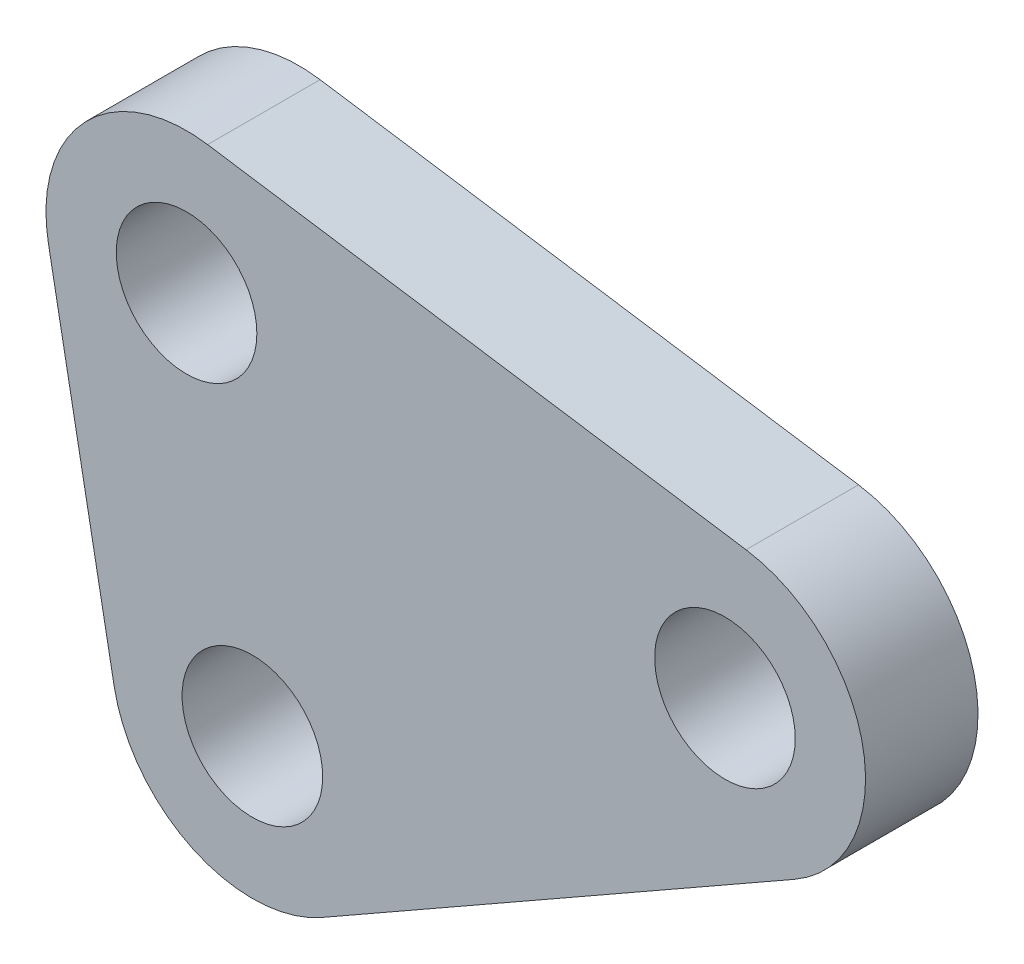
ISO-10303-21;
HEADER;
FILE_DESCRIPTION(('STEP AP214'),'2;1');
FILE_NAME('part.step','',(''),(''),'','','');
FILE_SCHEMA(('AUTOMOTIVE_DESIGN { 1 0 10303 214 1 1 1 1 }'));
ENDSEC;
DATA;
#1=APPLICATION_CONTEXT('core data for automotive mechanical design processes');
#2=APPLICATION_PROTOCOL_DEFINITION('international standard','automotive_design',2000,#1);
#3=PRODUCT_CONTEXT('',#1,'mechanical');
#4=PRODUCT('Part','Part','',(#3));
#5=PRODUCT_RELATED_PRODUCT_CATEGORY('part','',(#4));
#6=PRODUCT_DEFINITION_FORMATION('','',#4);
#7=PRODUCT_DEFINITION_CONTEXT('part definition',#1,'design');
#8=PRODUCT_DEFINITION('design','',#6,#7);
#9=PRODUCT_DEFINITION_SHAPE('','',#8);
#10=(LENGTH_UNIT() NAMED_UNIT(*) SI_UNIT(.MILLI.,.METRE.));
#11=(NAMED_UNIT(*) PLANE_ANGLE_UNIT() SI_UNIT($,.RADIAN.));
#12=(NAMED_UNIT(*) SI_UNIT($,.STERADIAN.) SOLID_ANGLE_UNIT());
#13=UNCERTAINTY_MEASURE_WITH_UNIT(LENGTH_MEASURE(1.E-05),#10,'distance_accuracy_value','');
#14=(GEOMETRIC_REPRESENTATION_CONTEXT(3) GLOBAL_UNCERTAINTY_ASSIGNED_CONTEXT((#13)) GLOBAL_UNIT_ASSIGNED_CONTEXT((#10,
#11,#12)) REPRESENTATION_CONTEXT('',''));
#15=CARTESIAN_POINT('',(0.,0.,0.));
#16=DIRECTION('',(0.,0.,1.));
#17=DIRECTION('',(1.,0.,0.));
#18=AXIS2_PLACEMENT_3D('',#15,#16,#17);
#19=CARTESIAN_POINT('',(26.1417069884607,72.0991364238817,4.));
#20=DIRECTION('',(0.,0.,1.));
#21=DIRECTION('',(1.,0.,0.));
#22=AXIS2_PLACEMENT_3D('',#19,#20,#21);
#23=PLANE('',#22);
#24=CARTESIAN_POINT('',(28.4825600069119,59.6183393892521,4.));
#25=DIRECTION('',(0.,0.,1.));
#26=DIRECTION('',(1.,0.,0.));
#27=AXIS2_PLACEMENT_3D('',#24,#25,#26);
#28=CIRCLE('',#27,2.5);
#29=CARTESIAN_POINT('',(30.9825600069119,59.6183393892521,4.));
#30=VERTEX_POINT('',#29);
#31=EDGE_CURVE('E188',#30,#30,#28,.T.);
#32=ORIENTED_EDGE('',*,*,#31,.F.);
#33=EDGE_LOOP('',(#32));
#34=FACE_BOUND('',#33,.T.);
#35=CARTESIAN_POINT('',(26.1417069884607,72.0991364238817,4.));
#36=DIRECTION('',(0.,0.,1.));
#37=DIRECTION('',(1.,0.,0.));
#38=AXIS2_PLACEMENT_3D('',#35,#36,#37);
#39=CIRCLE('',#38,5.);
#40=CARTESIAN_POINT('',(26.891590001168,77.042584154692,4.));
#41=VERTEX_POINT('',#40);
#42=CARTESIAN_POINT('',(21.227396240506,71.1774261263712,4.));
#43=VERTEX_POINT('',#42);
#44=EDGE_CURVE('E133',#41,#43,#39,.T.);
#45=ORIENTED_EDGE('',*,*,#44,.T.);
#46=DIRECTION('',(0.184342059502102,-0.98286214959094,0.));
#47=VECTOR('',#46,1.);
#48=CARTESIAN_POINT('',(21.227396240506,71.1774261263712,4.));
#49=LINE('',#48,#47);
#50=CARTESIAN_POINT('',(23.5682492589572,58.6966290917416,4.));
#51=VERTEX_POINT('',#50);
#52=EDGE_CURVE('E91',#43,#51,#49,.T.);
#53=ORIENTED_EDGE('',*,*,#52,.T.);
#54=CARTESIAN_POINT('',(28.4825600069119,59.6183393892521,4.));
#55=DIRECTION('',(0.,0.,1.));
#56=DIRECTION('',(1.,0.,0.));
#57=AXIS2_PLACEMENT_3D('',#54,#55,#56);
#58=CIRCLE('',#57,5.);
#59=CARTESIAN_POINT('',(30.9580435209812,55.2741500089912,4.));
#60=VERTEX_POINT('',#59);
#61=EDGE_CURVE('E104',#51,#60,#58,.T.);
#62=ORIENTED_EDGE('',*,*,#61,.T.);
#63=DIRECTION('',(0.86883787605217,0.495096702813858,0.));
#64=VECTOR('',#63,1.);
#65=CARTESIAN_POINT('',(30.9580435209812,55.2741500089912,4.));
#66=LINE('',#65,#64);
#67=CARTESIAN_POINT('',(47.7635886864171,64.8505856475972,4.));
#68=VERTEX_POINT('',#67);
#69=EDGE_CURVE('E98',#60,#68,#66,.T.);
#70=ORIENTED_EDGE('',*,*,#69,.T.);
#71=CARTESIAN_POINT('',(45.2881051723479,69.194775027858,4.));
#72=DIRECTION('',(0.,0.,1.));
#73=DIRECTION('',(1.,0.,0.));
#74=AXIS2_PLACEMENT_3D('',#71,#72,#73);
#75=CIRCLE('',#74,5.);
#76=CARTESIAN_POINT('',(46.0379881850551,74.1382227586683,4.));
#77=VERTEX_POINT('',#76);
#78=EDGE_CURVE('E102',#68,#77,#75,.T.);
#79=ORIENTED_EDGE('',*,*,#78,.T.);
#80=DIRECTION('',(-0.988689546162052,0.149976602541452,0.));
#81=VECTOR('',#80,1.);
#82=CARTESIAN_POINT('',(26.891590001168,77.042584154692,4.));
#83=LINE('',#82,#81);
#84=EDGE_CURVE('E54',#77,#41,#83,.T.);
#85=ORIENTED_EDGE('',*,*,#84,.T.);
#86=EDGE_LOOP('',(#45,#53,#62,#70,#79,#85));
#87=FACE_BOUND('',#86,.T.);
#88=CARTESIAN_POINT('',(26.1417069884607,72.0991364238817,4.));
#89=DIRECTION('',(0.,0.,1.));
#90=DIRECTION('',(1.,0.,0.));
#91=AXIS2_PLACEMENT_3D('',#88,#89,#90);
#92=CIRCLE('',#91,2.5);
#93=CARTESIAN_POINT('',(28.6417069884607,72.0991364238817,4.));
#94=VERTEX_POINT('',#93);
#95=EDGE_CURVE('E126',#94,#94,#92,.T.);
#96=ORIENTED_EDGE('',*,*,#95,.F.);
#97=EDGE_LOOP('',(#96));
#98=FACE_BOUND('',#97,.T.);
#99=CARTESIAN_POINT('',(45.2881051723479,69.194775027858,4.));
#100=DIRECTION('',(0.,0.,1.));
#101=DIRECTION('',(1.,0.,0.));
#102=AXIS2_PLACEMENT_3D('',#99,#100,#101);
#103=CIRCLE('',#102,2.5);
#104=CARTESIAN_POINT('',(47.7881051723479,69.194775027858,4.));
#105=VERTEX_POINT('',#104);
#106=EDGE_CURVE('E179',#105,#105,#103,.T.);
#107=ORIENTED_EDGE('',*,*,#106,.F.);
#108=EDGE_LOOP('',(#107));
#109=FACE_BOUND('',#108,.T.);
#110=ADVANCED_FACE('F37',(#34,#87,#98,#109),#23,.T.);
#111=CARTESIAN_POINT('',(26.1417069884607,72.0991364238817,0.));
#112=DIRECTION('',(0.,0.,1.));
#113=DIRECTION('',(1.,0.,0.));
#114=AXIS2_PLACEMENT_3D('',#111,#112,#113);
#115=PLANE('',#114);
#116=CARTESIAN_POINT('',(26.1417069884607,72.0991364238817,0.));
#117=DIRECTION('',(0.,0.,1.));
#118=DIRECTION('',(1.,0.,0.));
#119=AXIS2_PLACEMENT_3D('',#116,#117,#118);
#120=CIRCLE('',#119,5.);
#121=CARTESIAN_POINT('',(26.891590001168,77.042584154692,0.));
#122=VERTEX_POINT('',#121);
#123=CARTESIAN_POINT('',(21.227396240506,71.1774261263712,0.));
#124=VERTEX_POINT('',#123);
#125=EDGE_CURVE('E122',#122,#124,#120,.T.);
#126=ORIENTED_EDGE('',*,*,#125,.F.);
#127=DIRECTION('',(-0.988689546162052,0.149976602541452,0.));
#128=VECTOR('',#127,1.);
#129=CARTESIAN_POINT('',(26.891590001168,77.042584154692,0.));
#130=LINE('',#129,#128);
#131=CARTESIAN_POINT('',(46.0379881850551,74.1382227586683,0.));
#132=VERTEX_POINT('',#131);
#133=EDGE_CURVE('E83',#132,#122,#130,.T.);
#134=ORIENTED_EDGE('',*,*,#133,.F.);
#135=CARTESIAN_POINT('',(45.2881051723479,69.194775027858,0.));
#136=DIRECTION('',(0.,0.,1.));
#137=DIRECTION('',(1.,0.,0.));
#138=AXIS2_PLACEMENT_3D('',#135,#136,#137);
#139=CIRCLE('',#138,5.);
#140=CARTESIAN_POINT('',(47.7635886864171,64.8505856475972,0.));
#141=VERTEX_POINT('',#140);
#142=EDGE_CURVE('E77',#141,#132,#139,.T.);
#143=ORIENTED_EDGE('',*,*,#142,.F.);
#144=DIRECTION('',(0.86883787605217,0.495096702813858,0.));
#145=VECTOR('',#144,1.);
#146=CARTESIAN_POINT('',(30.9580435209812,55.2741500089912,0.));
#147=LINE('',#146,#145);
#148=CARTESIAN_POINT('',(30.9580435209812,55.2741500089912,0.));
#149=VERTEX_POINT('',#148);
#150=EDGE_CURVE('E112',#149,#141,#147,.T.);
#151=ORIENTED_EDGE('',*,*,#150,.F.);
#152=CARTESIAN_POINT('',(28.4825600069119,59.6183393892521,0.));
#153=DIRECTION('',(0.,0.,1.));
#154=DIRECTION('',(1.,0.,0.));
#155=AXIS2_PLACEMENT_3D('',#152,#153,#154);
#156=CIRCLE('',#155,5.);
#157=CARTESIAN_POINT('',(23.5682492589572,58.6966290917416,0.));
#158=VERTEX_POINT('',#157);
#159=EDGE_CURVE('E128',#158,#149,#156,.T.);
#160=ORIENTED_EDGE('',*,*,#159,.F.);
#161=DIRECTION('',(0.184342059502102,-0.98286214959094,0.));
#162=VECTOR('',#161,1.);
#163=CARTESIAN_POINT('',(21.227396240506,71.1774261263712,0.));
#164=LINE('',#163,#162);
#165=EDGE_CURVE('E125',#124,#158,#164,.T.);
#166=ORIENTED_EDGE('',*,*,#165,.F.);
#167=EDGE_LOOP('',(#126,#134,#143,#151,#160,#166));
#168=FACE_BOUND('',#167,.T.);
#169=CARTESIAN_POINT('',(26.1417069884607,72.0991364238817,0.));
#170=DIRECTION('',(0.,0.,1.));
#171=DIRECTION('',(1.,0.,0.));
#172=AXIS2_PLACEMENT_3D('',#169,#170,#171);
#173=CIRCLE('',#172,2.5);
#174=CARTESIAN_POINT('',(28.6417069884607,72.0991364238817,0.));
#175=VERTEX_POINT('',#174);
#176=EDGE_CURVE('E191',#175,#175,#173,.T.);
#177=ORIENTED_EDGE('',*,*,#176,.T.);
#178=EDGE_LOOP('',(#177));
#179=FACE_BOUND('',#178,.T.);
#180=CARTESIAN_POINT('',(28.4825600069119,59.6183393892521,0.));
#181=DIRECTION('',(0.,0.,1.));
#182=DIRECTION('',(1.,0.,0.));
#183=AXIS2_PLACEMENT_3D('',#180,#181,#182);
#184=CIRCLE('',#183,2.5);
#185=CARTESIAN_POINT('',(30.9825600069119,59.6183393892521,0.));
#186=VERTEX_POINT('',#185);
#187=EDGE_CURVE('E185',#186,#186,#184,.T.);
#188=ORIENTED_EDGE('',*,*,#187,.T.);
#189=EDGE_LOOP('',(#188));
#190=FACE_BOUND('',#189,.T.);
#191=CARTESIAN_POINT('',(45.2881051723479,69.194775027858,0.));
#192=DIRECTION('',(0.,0.,1.));
#193=DIRECTION('',(1.,0.,0.));
#194=AXIS2_PLACEMENT_3D('',#191,#192,#193);
#195=CIRCLE('',#194,2.5);
#196=CARTESIAN_POINT('',(47.7881051723479,69.194775027858,0.));
#197=VERTEX_POINT('',#196);
#198=EDGE_CURVE('E182',#197,#197,#195,.T.);
#199=ORIENTED_EDGE('',*,*,#198,.T.);
#200=EDGE_LOOP('',(#199));
#201=FACE_BOUND('',#200,.T.);
#202=ADVANCED_FACE('F142',(#168,#179,#190,#201),#115,.F.);
#203=CARTESIAN_POINT('',(26.1417069884607,72.0991364238817,4.));
#204=DIRECTION('',(0.,0.,-1.));
#205=DIRECTION('',(-1.,0.,0.));
#206=AXIS2_PLACEMENT_3D('',#203,#204,#205);
#207=CYLINDRICAL_SURFACE('',#206,5.);
#208=ORIENTED_EDGE('',*,*,#125,.T.);
#209=DIRECTION('',(0.,0.,-1.));
#210=VECTOR('',#209,1.);
#211=CARTESIAN_POINT('',(21.227396240506,71.1774261263712,4.));
#212=LINE('',#211,#210);
#213=EDGE_CURVE('E11',#43,#124,#212,.T.);
#214=ORIENTED_EDGE('',*,*,#213,.F.);
#215=ORIENTED_EDGE('',*,*,#44,.F.);
#216=DIRECTION('',(0.,0.,-1.));
#217=VECTOR('',#216,1.);
#218=CARTESIAN_POINT('',(26.891590001168,77.042584154692,4.));
#219=LINE('',#218,#217);
#220=EDGE_CURVE('E118',#41,#122,#219,.T.);
#221=ORIENTED_EDGE('',*,*,#220,.T.);
#222=EDGE_LOOP('',(#208,#214,#215,#221));
#223=FACE_BOUND('',#222,.T.);
#224=ADVANCED_FACE('F39',(#223),#207,.T.);
#225=CARTESIAN_POINT('',(21.227396240506,71.1774261263712,4.));
#226=DIRECTION('',(0.98286214959094,0.184342059502102,0.));
#227=DIRECTION('',(-0.184342059502102,0.98286214959094,0.));
#228=AXIS2_PLACEMENT_3D('',#225,#226,#227);
#229=PLANE('',#228);
#230=ORIENTED_EDGE('',*,*,#165,.T.);
#231=DIRECTION('',(0.,0.,-1.));
#232=VECTOR('',#231,1.);
#233=CARTESIAN_POINT('',(23.5682492589572,58.6966290917416,4.));
#234=LINE('',#233,#232);
#235=EDGE_CURVE('E46',#51,#158,#234,.T.);
#236=ORIENTED_EDGE('',*,*,#235,.F.);
#237=ORIENTED_EDGE('',*,*,#52,.F.);
#238=ORIENTED_EDGE('',*,*,#213,.T.);
#239=EDGE_LOOP('',(#230,#236,#237,#238));
#240=FACE_BOUND('',#239,.T.);
#241=ADVANCED_FACE('F233',(#240),#229,.F.);
#242=CARTESIAN_POINT('',(28.4825600069119,59.6183393892521,4.));
#243=DIRECTION('',(0.,0.,-1.));
#244=DIRECTION('',(-1.,0.,0.));
#245=AXIS2_PLACEMENT_3D('',#242,#243,#244);
#246=CYLINDRICAL_SURFACE('',#245,5.);
#247=ORIENTED_EDGE('',*,*,#159,.T.);
#248=DIRECTION('',(0.,0.,-1.));
#249=VECTOR('',#248,1.);
#250=CARTESIAN_POINT('',(30.9580435209812,55.2741500089912,4.));
#251=LINE('',#250,#249);
#252=EDGE_CURVE('E113',#60,#149,#251,.T.);
#253=ORIENTED_EDGE('',*,*,#252,.F.);
#254=ORIENTED_EDGE('',*,*,#61,.F.);
#255=ORIENTED_EDGE('',*,*,#235,.T.);
#256=EDGE_LOOP('',(#247,#253,#254,#255));
#257=FACE_BOUND('',#256,.T.);
#258=ADVANCED_FACE('F139',(#257),#246,.T.);
#259=CARTESIAN_POINT('',(30.9580435209812,55.2741500089912,4.));
#260=DIRECTION('',(-0.495096702813858,0.86883787605217,0.));
#261=DIRECTION('',(-0.86883787605217,-0.495096702813858,0.));
#262=AXIS2_PLACEMENT_3D('',#259,#260,#261);
#263=PLANE('',#262);
#264=ORIENTED_EDGE('',*,*,#150,.T.);
#265=DIRECTION('',(0.,0.,-1.));
#266=VECTOR('',#265,1.);
#267=CARTESIAN_POINT('',(47.7635886864171,64.8505856475972,4.));
#268=LINE('',#267,#266);
#269=EDGE_CURVE('E109',#68,#141,#268,.T.);
#270=ORIENTED_EDGE('',*,*,#269,.F.);
#271=ORIENTED_EDGE('',*,*,#69,.F.);
#272=ORIENTED_EDGE('',*,*,#252,.T.);
#273=EDGE_LOOP('',(#264,#270,#271,#272));
#274=FACE_BOUND('',#273,.T.);
#275=ADVANCED_FACE('F110',(#274),#263,.F.);
#276=CARTESIAN_POINT('',(45.2881051723479,69.194775027858,4.));
#277=DIRECTION('',(0.,0.,-1.));
#278=DIRECTION('',(-1.,0.,0.));
#279=AXIS2_PLACEMENT_3D('',#276,#277,#278);
#280=CYLINDRICAL_SURFACE('',#279,5.);
#281=ORIENTED_EDGE('',*,*,#142,.T.);
#282=DIRECTION('',(0.,0.,-1.));
#283=VECTOR('',#282,1.);
#284=CARTESIAN_POINT('',(46.0379881850551,74.1382227586683,4.));
#285=LINE('',#284,#283);
#286=EDGE_CURVE('E114',#77,#132,#285,.T.);
#287=ORIENTED_EDGE('',*,*,#286,.F.);
#288=ORIENTED_EDGE('',*,*,#78,.F.);
#289=ORIENTED_EDGE('',*,*,#269,.T.);
#290=EDGE_LOOP('',(#281,#287,#288,#289));
#291=FACE_BOUND('',#290,.T.);
#292=ADVANCED_FACE('F116',(#291),#280,.T.);
#293=CARTESIAN_POINT('',(26.891590001168,77.042584154692,4.));
#294=DIRECTION('',(-0.149976602541452,-0.988689546162052,0.));
#295=DIRECTION('',(0.988689546162052,-0.149976602541452,0.));
#296=AXIS2_PLACEMENT_3D('',#293,#294,#295);
#297=PLANE('',#296);
#298=ORIENTED_EDGE('',*,*,#133,.T.);
#299=ORIENTED_EDGE('',*,*,#220,.F.);
#300=ORIENTED_EDGE('',*,*,#84,.F.);
#301=ORIENTED_EDGE('',*,*,#286,.T.);
#302=EDGE_LOOP('',(#298,#299,#300,#301));
#303=FACE_BOUND('',#302,.T.);
#304=ADVANCED_FACE('F147',(#303),#297,.F.);
#305=CARTESIAN_POINT('',(26.1417069884607,72.0991364238817,4.));
#306=DIRECTION('',(0.,0.,-1.));
#307=DIRECTION('',(-1.,0.,0.));
#308=AXIS2_PLACEMENT_3D('',#305,#306,#307);
#309=CYLINDRICAL_SURFACE('',#308,2.5);
#310=ORIENTED_EDGE('',*,*,#95,.T.);
#311=EDGE_LOOP('',(#310));
#312=FACE_BOUND('',#311,.T.);
#313=ORIENTED_EDGE('',*,*,#176,.F.);
#314=EDGE_LOOP('',(#313));
#315=FACE_BOUND('',#314,.T.);
#316=ADVANCED_FACE('F149',(#312,#315),#309,.F.);
#317=CARTESIAN_POINT('',(28.4825600069119,59.6183393892521,4.));
#318=DIRECTION('',(0.,0.,-1.));
#319=DIRECTION('',(-1.,0.,0.));
#320=AXIS2_PLACEMENT_3D('',#317,#318,#319);
#321=CYLINDRICAL_SURFACE('',#320,2.5);
#322=ORIENTED_EDGE('',*,*,#31,.T.);
#323=EDGE_LOOP('',(#322));
#324=FACE_BOUND('',#323,.T.);
#325=ORIENTED_EDGE('',*,*,#187,.F.);
#326=EDGE_LOOP('',(#325));
#327=FACE_BOUND('',#326,.T.);
#328=ADVANCED_FACE('F155',(#324,#327),#321,.F.);
#329=CARTESIAN_POINT('',(45.2881051723479,69.194775027858,4.));
#330=DIRECTION('',(0.,0.,-1.));
#331=DIRECTION('',(-1.,0.,0.));
#332=AXIS2_PLACEMENT_3D('',#329,#330,#331);
#333=CYLINDRICAL_SURFACE('',#332,2.5);
#334=ORIENTED_EDGE('',*,*,#106,.T.);
#335=EDGE_LOOP('',(#334));
#336=FACE_BOUND('',#335,.T.);
#337=ORIENTED_EDGE('',*,*,#198,.F.);
#338=EDGE_LOOP('',(#337));
#339=FACE_BOUND('',#338,.T.);
#340=ADVANCED_FACE('F170',(#336,#339),#333,.F.);
#341=CLOSED_SHELL('',(#110,#202,#224,#241,#258,#275,#292,#304,#316,#328,#340));
#342=MANIFOLD_SOLID_BREP('B2',#341);
#343=ADVANCED_BREP_SHAPE_REPRESENTATION('',(#18,#342),#14);
#344=SHAPE_DEFINITION_REPRESENTATION(#9,#343);
ENDSEC;
END-ISO-10303-21;
